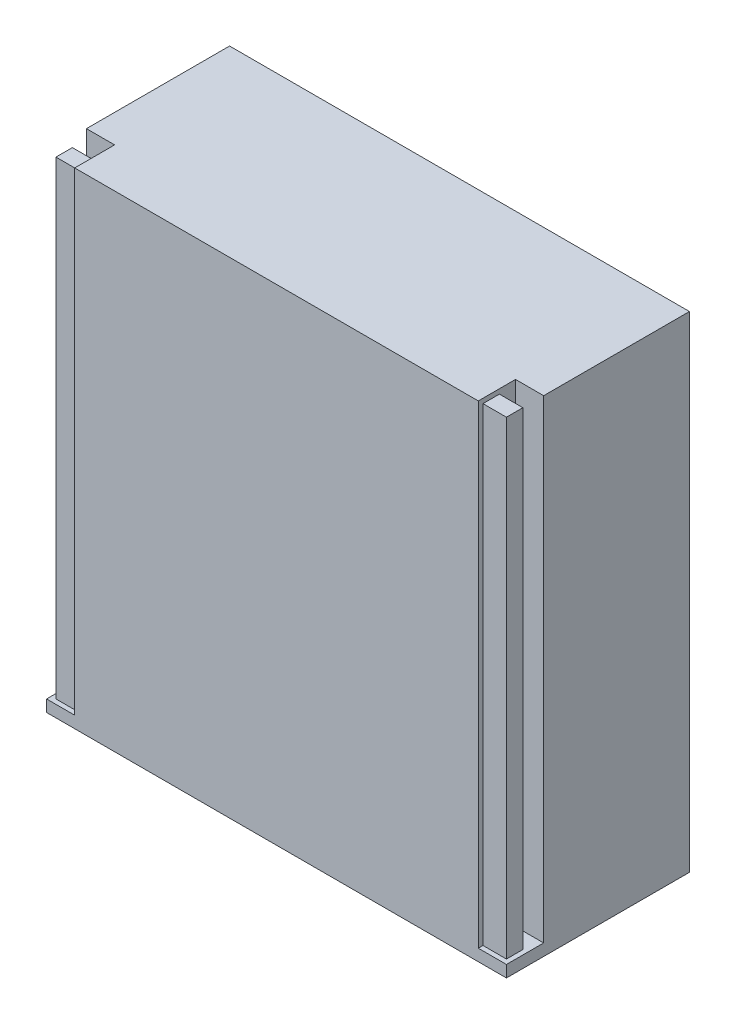
ISO-10303-21;
HEADER;
FILE_DESCRIPTION(('STEP AP214'),'2;1');
FILE_NAME('part.step','',(''),(''),'','','');
FILE_SCHEMA(('AUTOMOTIVE_DESIGN { 1 0 10303 214 1 1 1 1 }'));
ENDSEC;
DATA;
#1=APPLICATION_CONTEXT('core data for automotive mechanical design processes');
#2=APPLICATION_PROTOCOL_DEFINITION('international standard','automotive_design',2000,#1);
#3=PRODUCT_CONTEXT('',#1,'mechanical');
#4=PRODUCT('Part','Part','',(#3));
#5=PRODUCT_RELATED_PRODUCT_CATEGORY('part','',(#4));
#6=PRODUCT_DEFINITION_FORMATION('','',#4);
#7=PRODUCT_DEFINITION_CONTEXT('part definition',#1,'design');
#8=PRODUCT_DEFINITION('design','',#6,#7);
#9=PRODUCT_DEFINITION_SHAPE('','',#8);
#10=(LENGTH_UNIT() NAMED_UNIT(*) SI_UNIT(.MILLI.,.METRE.));
#11=(NAMED_UNIT(*) PLANE_ANGLE_UNIT() SI_UNIT($,.RADIAN.));
#12=(NAMED_UNIT(*) SI_UNIT($,.STERADIAN.) SOLID_ANGLE_UNIT());
#13=UNCERTAINTY_MEASURE_WITH_UNIT(LENGTH_MEASURE(1.E-05),#10,'distance_accuracy_value','');
#14=(GEOMETRIC_REPRESENTATION_CONTEXT(3) GLOBAL_UNCERTAINTY_ASSIGNED_CONTEXT((#13)) GLOBAL_UNIT_ASSIGNED_CONTEXT((#10,
#11,#12)) REPRESENTATION_CONTEXT('',''));
#15=CARTESIAN_POINT('',(0.,0.,0.));
#16=DIRECTION('',(0.,0.,1.));
#17=DIRECTION('',(1.,0.,0.));
#18=AXIS2_PLACEMENT_3D('',#15,#16,#17);
#19=CARTESIAN_POINT('',(0.,205.,0.));
#20=DIRECTION('',(0.,-1.,0.));
#21=DIRECTION('',(0.,0.,-1.));
#22=AXIS2_PLACEMENT_3D('',#19,#20,#21);
#23=PLANE('',#22);
#24=DIRECTION('',(0.,0.,-1.));
#25=VECTOR('',#24,1.);
#26=CARTESIAN_POINT('',(37.9403578528827,205.,24.1278950532166));
#27=LINE('',#26,#25);
#28=CARTESIAN_POINT('',(37.9403578528827,205.,38.));
#29=VERTEX_POINT('',#28);
#30=CARTESIAN_POINT('',(37.9403578528827,205.,31.));
#31=VERTEX_POINT('',#30);
#32=EDGE_CURVE('E11',#29,#31,#27,.T.);
#33=ORIENTED_EDGE('',*,*,#32,.F.);
#34=DIRECTION('',(1.,0.,0.));
#35=VECTOR('',#34,1.);
#36=CARTESIAN_POINT('',(37.9403578528827,205.,38.));
#37=LINE('',#36,#35);
#38=CARTESIAN_POINT('',(47.9403578528827,205.,38.));
#39=VERTEX_POINT('',#38);
#40=EDGE_CURVE('E393',#29,#39,#37,.T.);
#41=ORIENTED_EDGE('',*,*,#40,.T.);
#42=DIRECTION('',(0.,0.,-1.));
#43=VECTOR('',#42,1.);
#44=CARTESIAN_POINT('',(47.9403578528827,205.,38.));
#45=LINE('',#44,#43);
#46=CARTESIAN_POINT('',(47.9403578528827,205.,31.));
#47=VERTEX_POINT('',#46);
#48=EDGE_CURVE('E387',#39,#47,#45,.T.);
#49=ORIENTED_EDGE('',*,*,#48,.T.);
#50=DIRECTION('',(-1.,0.,0.));
#51=VECTOR('',#50,1.);
#52=CARTESIAN_POINT('',(47.9403578528827,205.,31.));
#53=LINE('',#52,#51);
#54=EDGE_CURVE('E390',#47,#31,#53,.T.);
#55=ORIENTED_EDGE('',*,*,#54,.T.);
#56=EDGE_LOOP('',(#33,#41,#49,#55));
#57=FACE_BOUND('',#56,.T.);
#58=ADVANCED_FACE('F39',(#57),#23,.F.);
#59=DIRECTION('',(0.,0.,1.));
#60=VECTOR('',#59,1.);
#61=CARTESIAN_POINT('',(-134.059642147117,205.,40.));
#62=LINE('',#61,#60);
#63=CARTESIAN_POINT('',(-134.059642147117,205.,31.));
#64=VERTEX_POINT('',#63);
#65=CARTESIAN_POINT('',(-134.059642147117,205.,38.));
#66=VERTEX_POINT('',#65);
#67=EDGE_CURVE('E48',#64,#66,#62,.T.);
#68=ORIENTED_EDGE('',*,*,#67,.F.);
#69=DIRECTION('',(-1.,0.,0.));
#70=VECTOR('',#69,1.);
#71=CARTESIAN_POINT('',(-144.059642147117,205.,31.));
#72=LINE('',#71,#70);
#73=CARTESIAN_POINT('',(-144.059642147117,205.,31.));
#74=VERTEX_POINT('',#73);
#75=EDGE_CURVE('E412',#64,#74,#72,.T.);
#76=ORIENTED_EDGE('',*,*,#75,.T.);
#77=DIRECTION('',(0.,0.,1.));
#78=VECTOR('',#77,1.);
#79=CARTESIAN_POINT('',(-144.059642147117,205.,38.));
#80=LINE('',#79,#78);
#81=CARTESIAN_POINT('',(-144.059642147117,205.,38.));
#82=VERTEX_POINT('',#81);
#83=EDGE_CURVE('E414',#74,#82,#80,.T.);
#84=ORIENTED_EDGE('',*,*,#83,.T.);
#85=DIRECTION('',(1.,0.,0.));
#86=VECTOR('',#85,1.);
#87=CARTESIAN_POINT('',(-134.059642147117,205.,38.));
#88=LINE('',#87,#86);
#89=EDGE_CURVE('E417',#82,#66,#88,.T.);
#90=ORIENTED_EDGE('',*,*,#89,.T.);
#91=EDGE_LOOP('',(#68,#76,#84,#90));
#92=FACE_BOUND('',#91,.T.);
#93=ADVANCED_FACE('F521',(#92),#23,.F.);
#94=CARTESIAN_POINT('',(0.,5.,0.));
#95=DIRECTION('',(0.,1.,0.));
#96=DIRECTION('',(0.,0.,1.));
#97=AXIS2_PLACEMENT_3D('',#94,#95,#96);
#98=PLANE('',#97);
#99=DIRECTION('',(1.,0.,0.));
#100=VECTOR('',#99,1.);
#101=CARTESIAN_POINT('',(-146.059642147117,5.,40.));
#102=LINE('',#101,#100);
#103=CARTESIAN_POINT('',(-146.059642147117,5.,40.));
#104=VERTEX_POINT('',#103);
#105=CARTESIAN_POINT('',(-134.059642147117,5.,40.));
#106=VERTEX_POINT('',#105);
#107=EDGE_CURVE('E446',#104,#106,#102,.T.);
#108=ORIENTED_EDGE('',*,*,#107,.T.);
#109=DIRECTION('',(0.,0.,1.));
#110=VECTOR('',#109,1.);
#111=CARTESIAN_POINT('',(-134.059642147117,5.,23.));
#112=LINE('',#111,#110);
#113=CARTESIAN_POINT('',(-134.059642147117,5.,38.));
#114=VERTEX_POINT('',#113);
#115=EDGE_CURVE('E327',#114,#106,#112,.T.);
#116=ORIENTED_EDGE('',*,*,#115,.F.);
#117=DIRECTION('',(1.,0.,0.));
#118=VECTOR('',#117,1.);
#119=CARTESIAN_POINT('',(-134.059642147117,5.,38.));
#120=LINE('',#119,#118);
#121=CARTESIAN_POINT('',(-144.059642147117,5.,38.));
#122=VERTEX_POINT('',#121);
#123=EDGE_CURVE('E415',#122,#114,#120,.T.);
#124=ORIENTED_EDGE('',*,*,#123,.F.);
#125=DIRECTION('',(0.,0.,1.));
#126=VECTOR('',#125,1.);
#127=CARTESIAN_POINT('',(-144.059642147117,5.,38.));
#128=LINE('',#127,#126);
#129=CARTESIAN_POINT('',(-144.059642147117,5.,31.));
#130=VERTEX_POINT('',#129);
#131=EDGE_CURVE('E421',#130,#122,#128,.T.);
#132=ORIENTED_EDGE('',*,*,#131,.F.);
#133=DIRECTION('',(-1.,0.,0.));
#134=VECTOR('',#133,1.);
#135=CARTESIAN_POINT('',(-144.059642147117,5.,31.));
#136=LINE('',#135,#134);
#137=CARTESIAN_POINT('',(-134.059642147117,5.,31.));
#138=VERTEX_POINT('',#137);
#139=EDGE_CURVE('E411',#138,#130,#136,.T.);
#140=ORIENTED_EDGE('',*,*,#139,.F.);
#141=CARTESIAN_POINT('',(-134.059642147117,5.,23.));
#142=VERTEX_POINT('',#141);
#143=EDGE_CURVE('E328',#142,#138,#112,.T.);
#144=ORIENTED_EDGE('',*,*,#143,.F.);
#145=DIRECTION('',(1.,0.,0.));
#146=VECTOR('',#145,1.);
#147=CARTESIAN_POINT('',(-146.059642147117,5.,23.));
#148=LINE('',#147,#146);
#149=CARTESIAN_POINT('',(-146.059642147117,5.,23.));
#150=VERTEX_POINT('',#149);
#151=EDGE_CURVE('E298',#150,#142,#148,.T.);
#152=ORIENTED_EDGE('',*,*,#151,.F.);
#153=DIRECTION('',(0.,0.,1.));
#154=VECTOR('',#153,1.);
#155=CARTESIAN_POINT('',(-146.059642147117,5.,-38.));
#156=LINE('',#155,#154);
#157=EDGE_CURVE('E443',#150,#104,#156,.T.);
#158=ORIENTED_EDGE('',*,*,#157,.T.);
#159=EDGE_LOOP('',(#108,#116,#124,#132,#140,#144,#152,#158));
#160=FACE_BOUND('',#159,.T.);
#161=ADVANCED_FACE('F485',(#160),#98,.T.);
#162=DIRECTION('',(1.,0.,0.));
#163=VECTOR('',#162,1.);
#164=CARTESIAN_POINT('',(37.9403578528827,5.,38.));
#165=LINE('',#164,#163);
#166=CARTESIAN_POINT('',(37.9403578528827,5.,38.));
#167=VERTEX_POINT('',#166);
#168=CARTESIAN_POINT('',(47.9403578528827,5.,38.));
#169=VERTEX_POINT('',#168);
#170=EDGE_CURVE('E391',#167,#169,#165,.T.);
#171=ORIENTED_EDGE('',*,*,#170,.F.);
#172=DIRECTION('',(0.,0.,-1.));
#173=VECTOR('',#172,1.);
#174=CARTESIAN_POINT('',(37.9403578528827,5.,40.));
#175=LINE('',#174,#173);
#176=CARTESIAN_POINT('',(37.9403578528827,5.,40.));
#177=VERTEX_POINT('',#176);
#178=EDGE_CURVE('E331',#177,#167,#175,.T.);
#179=ORIENTED_EDGE('',*,*,#178,.F.);
#180=CARTESIAN_POINT('',(49.9403578528827,5.,40.));
#181=VERTEX_POINT('',#180);
#182=EDGE_CURVE('E445',#177,#181,#102,.T.);
#183=ORIENTED_EDGE('',*,*,#182,.T.);
#184=DIRECTION('',(0.,0.,-1.));
#185=VECTOR('',#184,1.);
#186=CARTESIAN_POINT('',(49.9403578528827,5.,-38.));
#187=LINE('',#186,#185);
#188=CARTESIAN_POINT('',(49.9403578528827,5.,24.1278950532166));
#189=VERTEX_POINT('',#188);
#190=EDGE_CURVE('E436',#181,#189,#187,.T.);
#191=ORIENTED_EDGE('',*,*,#190,.T.);
#192=DIRECTION('',(1.,0.,0.));
#193=VECTOR('',#192,1.);
#194=CARTESIAN_POINT('',(37.9403578528827,5.,24.1278950532166));
#195=LINE('',#194,#193);
#196=CARTESIAN_POINT('',(37.9403578528827,5.,24.1278950532166));
#197=VERTEX_POINT('',#196);
#198=EDGE_CURVE('E333',#197,#189,#195,.T.);
#199=ORIENTED_EDGE('',*,*,#198,.F.);
#200=CARTESIAN_POINT('',(37.9403578528827,5.,31.));
#201=VERTEX_POINT('',#200);
#202=EDGE_CURVE('E330',#201,#197,#175,.T.);
#203=ORIENTED_EDGE('',*,*,#202,.F.);
#204=DIRECTION('',(-1.,0.,0.));
#205=VECTOR('',#204,1.);
#206=CARTESIAN_POINT('',(47.9403578528827,5.,31.));
#207=LINE('',#206,#205);
#208=CARTESIAN_POINT('',(47.9403578528827,5.,31.));
#209=VERTEX_POINT('',#208);
#210=EDGE_CURVE('E398',#209,#201,#207,.T.);
#211=ORIENTED_EDGE('',*,*,#210,.F.);
#212=DIRECTION('',(0.,0.,-1.));
#213=VECTOR('',#212,1.);
#214=CARTESIAN_POINT('',(47.9403578528827,5.,38.));
#215=LINE('',#214,#213);
#216=EDGE_CURVE('E386',#169,#209,#215,.T.);
#217=ORIENTED_EDGE('',*,*,#216,.F.);
#218=EDGE_LOOP('',(#171,#179,#183,#191,#199,#203,#211,#217));
#219=FACE_BOUND('',#218,.T.);
#220=ADVANCED_FACE('F500',(#219),#98,.T.);
#221=CARTESIAN_POINT('',(-83.0596421471173,5.,1.00000000000001));
#222=DIRECTION('',(0.,1.,0.));
#223=DIRECTION('',(0.,0.,1.));
#224=AXIS2_PLACEMENT_3D('',#221,#222,#223);
#225=CIRCLE('',#224,8.);
#226=CARTESIAN_POINT('',(-83.0596421471173,5.,-6.99999999999999));
#227=VERTEX_POINT('',#226);
#228=CARTESIAN_POINT('',(-83.0596421471173,5.,9.00000000000002));
#229=VERTEX_POINT('',#228);
#230=EDGE_CURVE('E271',#227,#229,#225,.T.);
#231=ORIENTED_EDGE('',*,*,#230,.F.);
#232=DIRECTION('',(-1.,0.,0.));
#233=VECTOR('',#232,1.);
#234=CARTESIAN_POINT('',(0.,5.,-6.99999999999998));
#235=LINE('',#234,#233);
#236=CARTESIAN_POINT('',(-13.0596421471173,5.,-6.99999999999998));
#237=VERTEX_POINT('',#236);
#238=EDGE_CURVE('E264',#237,#227,#235,.T.);
#239=ORIENTED_EDGE('',*,*,#238,.F.);
#240=CARTESIAN_POINT('',(-13.0596421471173,5.,1.00000000000002));
#241=DIRECTION('',(0.,1.,0.));
#242=DIRECTION('',(0.,0.,1.));
#243=AXIS2_PLACEMENT_3D('',#240,#241,#242);
#244=CIRCLE('',#243,8.);
#245=CARTESIAN_POINT('',(-13.0596421471173,5.,9.00000000000003));
#246=VERTEX_POINT('',#245);
#247=EDGE_CURVE('E244',#246,#237,#244,.T.);
#248=ORIENTED_EDGE('',*,*,#247,.F.);
#249=DIRECTION('',(1.,0.,0.));
#250=VECTOR('',#249,1.);
#251=CARTESIAN_POINT('',(0.,5.,9.00000000000003));
#252=LINE('',#251,#250);
#253=EDGE_CURVE('E269',#229,#246,#252,.T.);
#254=ORIENTED_EDGE('',*,*,#253,.F.);
#255=EDGE_LOOP('',(#231,#239,#248,#254));
#256=FACE_BOUND('',#255,.T.);
#257=DIRECTION('',(-1.,0.,0.));
#258=VECTOR('',#257,1.);
#259=CARTESIAN_POINT('',(47.9403578528827,5.,22.1278950532166));
#260=LINE('',#259,#258);
#261=CARTESIAN_POINT('',(47.9403578528827,5.,22.1278950532166));
#262=VERTEX_POINT('',#261);
#263=CARTESIAN_POINT('',(35.9403578528827,5.,22.1278950532166));
#264=VERTEX_POINT('',#263);
#265=EDGE_CURVE('E337',#262,#264,#260,.T.);
#266=ORIENTED_EDGE('',*,*,#265,.F.);
#267=DIRECTION('',(0.,0.,1.));
#268=VECTOR('',#267,1.);
#269=CARTESIAN_POINT('',(47.9403578528827,5.,-38.));
#270=LINE('',#269,#268);
#271=CARTESIAN_POINT('',(47.9403578528827,5.,-38.));
#272=VERTEX_POINT('',#271);
#273=EDGE_CURVE('E335',#272,#262,#270,.T.);
#274=ORIENTED_EDGE('',*,*,#273,.F.);
#275=DIRECTION('',(-1.,0.,0.));
#276=VECTOR('',#275,1.);
#277=CARTESIAN_POINT('',(-146.059642147117,5.,-38.));
#278=LINE('',#277,#276);
#279=CARTESIAN_POINT('',(-144.059642147117,5.,-38.));
#280=VERTEX_POINT('',#279);
#281=EDGE_CURVE('E439',#272,#280,#278,.T.);
#282=ORIENTED_EDGE('',*,*,#281,.T.);
#283=DIRECTION('',(0.,0.,-1.));
#284=VECTOR('',#283,1.);
#285=CARTESIAN_POINT('',(-144.059642147117,5.,21.1709039048602));
#286=LINE('',#285,#284);
#287=CARTESIAN_POINT('',(-144.059642147117,5.,21.1709039048602));
#288=VERTEX_POINT('',#287);
#289=EDGE_CURVE('E307',#288,#280,#286,.T.);
#290=ORIENTED_EDGE('',*,*,#289,.F.);
#291=DIRECTION('',(-1.,0.,0.));
#292=VECTOR('',#291,1.);
#293=CARTESIAN_POINT('',(-132.059642147117,5.,21.1709039048602));
#294=LINE('',#293,#292);
#295=CARTESIAN_POINT('',(-132.059642147117,5.,21.1709039048602));
#296=VERTEX_POINT('',#295);
#297=EDGE_CURVE('E345',#296,#288,#294,.T.);
#298=ORIENTED_EDGE('',*,*,#297,.F.);
#299=DIRECTION('',(0.,0.,-1.));
#300=VECTOR('',#299,1.);
#301=CARTESIAN_POINT('',(-132.059642147117,5.,38.));
#302=LINE('',#301,#300);
#303=CARTESIAN_POINT('',(-132.059642147117,5.,38.));
#304=VERTEX_POINT('',#303);
#305=EDGE_CURVE('E343',#304,#296,#302,.T.);
#306=ORIENTED_EDGE('',*,*,#305,.F.);
#307=DIRECTION('',(-1.,0.,0.));
#308=VECTOR('',#307,1.);
#309=CARTESIAN_POINT('',(35.9403578528827,5.,38.));
#310=LINE('',#309,#308);
#311=CARTESIAN_POINT('',(35.9403578528827,5.,38.));
#312=VERTEX_POINT('',#311);
#313=EDGE_CURVE('E341',#312,#304,#310,.T.);
#314=ORIENTED_EDGE('',*,*,#313,.F.);
#315=DIRECTION('',(0.,0.,1.));
#316=VECTOR('',#315,1.);
#317=CARTESIAN_POINT('',(35.9403578528827,5.,22.1278950532166));
#318=LINE('',#317,#316);
#319=EDGE_CURVE('E339',#264,#312,#318,.T.);
#320=ORIENTED_EDGE('',*,*,#319,.F.);
#321=EDGE_LOOP('',(#266,#274,#282,#290,#298,#306,#314,#320));
#322=FACE_BOUND('',#321,.T.);
#323=ADVANCED_FACE('F547',(#256,#322),#98,.T.);
#324=CARTESIAN_POINT('',(49.9403578528827,5.,-38.));
#325=DIRECTION('',(-1.,0.,0.));
#326=DIRECTION('',(0.,0.,1.));
#327=AXIS2_PLACEMENT_3D('',#324,#325,#326);
#328=PLANE('',#327);
#329=DIRECTION('',(0.,0.,-1.));
#330=VECTOR('',#329,1.);
#331=CARTESIAN_POINT('',(49.9403578528827,0.,-38.));
#332=LINE('',#331,#330);
#333=CARTESIAN_POINT('',(49.9403578528827,0.,40.));
#334=VERTEX_POINT('',#333);
#335=CARTESIAN_POINT('',(49.9403578528827,0.,-38.));
#336=VERTEX_POINT('',#335);
#337=EDGE_CURVE('E435',#334,#336,#332,.T.);
#338=ORIENTED_EDGE('',*,*,#337,.T.);
#339=DIRECTION('',(0.,-1.,0.));
#340=VECTOR('',#339,1.);
#341=CARTESIAN_POINT('',(49.9403578528827,5.,-38.));
#342=LINE('',#341,#340);
#343=CARTESIAN_POINT('',(49.9403578528827,207.,-38.));
#344=VERTEX_POINT('',#343);
#345=EDGE_CURVE('E43',#344,#336,#342,.T.);
#346=ORIENTED_EDGE('',*,*,#345,.F.);
#347=DIRECTION('',(0.,0.,-1.));
#348=VECTOR('',#347,1.);
#349=CARTESIAN_POINT('',(49.9403578528827,207.,-38.));
#350=LINE('',#349,#348);
#351=CARTESIAN_POINT('',(49.9403578528827,207.,24.1278950532166));
#352=VERTEX_POINT('',#351);
#353=EDGE_CURVE('E292',#352,#344,#350,.T.);
#354=ORIENTED_EDGE('',*,*,#353,.F.);
#355=DIRECTION('',(0.,-1.,0.));
#356=VECTOR('',#355,1.);
#357=CARTESIAN_POINT('',(49.9403578528827,205.,24.1278950532166));
#358=LINE('',#357,#356);
#359=EDGE_CURVE('E370',#352,#189,#358,.T.);
#360=ORIENTED_EDGE('',*,*,#359,.T.);
#361=ORIENTED_EDGE('',*,*,#190,.F.);
#362=DIRECTION('',(0.,-1.,0.));
#363=VECTOR('',#362,1.);
#364=CARTESIAN_POINT('',(49.9403578528827,5.,40.));
#365=LINE('',#364,#363);
#366=EDGE_CURVE('E449',#181,#334,#365,.T.);
#367=ORIENTED_EDGE('',*,*,#366,.T.);
#368=EDGE_LOOP('',(#338,#346,#354,#360,#361,#367));
#369=FACE_BOUND('',#368,.T.);
#370=ADVANCED_FACE('F41',(#369),#328,.F.);
#371=CARTESIAN_POINT('',(-146.059642147117,5.,-38.));
#372=DIRECTION('',(0.,0.,1.));
#373=DIRECTION('',(1.,0.,0.));
#374=AXIS2_PLACEMENT_3D('',#371,#372,#373);
#375=PLANE('',#374);
#376=DIRECTION('',(0.,-1.,0.));
#377=VECTOR('',#376,1.);
#378=CARTESIAN_POINT('',(47.9403578528827,205.,-38.));
#379=LINE('',#378,#377);
#380=CARTESIAN_POINT('',(47.9403578528827,205.,-38.));
#381=VERTEX_POINT('',#380);
#382=EDGE_CURVE('E368',#381,#272,#379,.T.);
#383=ORIENTED_EDGE('',*,*,#382,.F.);
#384=DIRECTION('',(-1.,0.,0.));
#385=VECTOR('',#384,1.);
#386=CARTESIAN_POINT('',(-146.059642147117,205.,-38.));
#387=LINE('',#386,#385);
#388=CARTESIAN_POINT('',(-144.059642147117,205.,-38.));
#389=VERTEX_POINT('',#388);
#390=EDGE_CURVE('E273',#381,#389,#387,.T.);
#391=ORIENTED_EDGE('',*,*,#390,.T.);
#392=DIRECTION('',(0.,-1.,0.));
#393=VECTOR('',#392,1.);
#394=CARTESIAN_POINT('',(-144.059642147117,205.,-38.));
#395=LINE('',#394,#393);
#396=EDGE_CURVE('E325',#389,#280,#395,.T.);
#397=ORIENTED_EDGE('',*,*,#396,.T.);
#398=ORIENTED_EDGE('',*,*,#281,.F.);
#399=EDGE_LOOP('',(#383,#391,#397,#398));
#400=FACE_BOUND('',#399,.T.);
#401=DIRECTION('',(-1.,0.,0.));
#402=VECTOR('',#401,1.);
#403=CARTESIAN_POINT('',(-146.059642147117,0.,-38.));
#404=LINE('',#403,#402);
#405=CARTESIAN_POINT('',(-146.059642147117,0.,-38.));
#406=VERTEX_POINT('',#405);
#407=EDGE_CURVE('E452',#336,#406,#404,.T.);
#408=ORIENTED_EDGE('',*,*,#407,.T.);
#409=DIRECTION('',(0.,-1.,0.));
#410=VECTOR('',#409,1.);
#411=CARTESIAN_POINT('',(-146.059642147117,5.,-38.));
#412=LINE('',#411,#410);
#413=CARTESIAN_POINT('',(-146.059642147117,207.,-38.));
#414=VERTEX_POINT('',#413);
#415=EDGE_CURVE('E461',#414,#406,#412,.T.);
#416=ORIENTED_EDGE('',*,*,#415,.F.);
#417=DIRECTION('',(-1.,0.,0.));
#418=VECTOR('',#417,1.);
#419=CARTESIAN_POINT('',(-146.059642147117,207.,-38.));
#420=LINE('',#419,#418);
#421=EDGE_CURVE('E295',#344,#414,#420,.T.);
#422=ORIENTED_EDGE('',*,*,#421,.F.);
#423=ORIENTED_EDGE('',*,*,#345,.T.);
#424=EDGE_LOOP('',(#408,#416,#422,#423));
#425=FACE_BOUND('',#424,.T.);
#426=ADVANCED_FACE('F469',(#400,#425),#375,.F.);
#427=CARTESIAN_POINT('',(-146.059642147117,5.,-38.));
#428=DIRECTION('',(1.,0.,0.));
#429=DIRECTION('',(0.,0.,-1.));
#430=AXIS2_PLACEMENT_3D('',#427,#428,#429);
#431=PLANE('',#430);
#432=DIRECTION('',(0.,0.,1.));
#433=VECTOR('',#432,1.);
#434=CARTESIAN_POINT('',(-146.059642147117,0.,-38.));
#435=LINE('',#434,#433);
#436=CARTESIAN_POINT('',(-146.059642147117,0.,40.));
#437=VERTEX_POINT('',#436);
#438=EDGE_CURVE('E454',#406,#437,#435,.T.);
#439=ORIENTED_EDGE('',*,*,#438,.T.);
#440=DIRECTION('',(0.,-1.,0.));
#441=VECTOR('',#440,1.);
#442=CARTESIAN_POINT('',(-146.059642147117,5.,40.));
#443=LINE('',#442,#441);
#444=EDGE_CURVE('E459',#104,#437,#443,.T.);
#445=ORIENTED_EDGE('',*,*,#444,.F.);
#446=ORIENTED_EDGE('',*,*,#157,.F.);
#447=DIRECTION('',(0.,-1.,0.));
#448=VECTOR('',#447,1.);
#449=CARTESIAN_POINT('',(-146.059642147117,205.,23.));
#450=LINE('',#449,#448);
#451=CARTESIAN_POINT('',(-146.059642147117,207.,23.));
#452=VERTEX_POINT('',#451);
#453=EDGE_CURVE('E384',#452,#150,#450,.T.);
#454=ORIENTED_EDGE('',*,*,#453,.F.);
#455=DIRECTION('',(0.,0.,1.));
#456=VECTOR('',#455,1.);
#457=CARTESIAN_POINT('',(-146.059642147117,207.,23.));
#458=LINE('',#457,#456);
#459=EDGE_CURVE('E274',#414,#452,#458,.T.);
#460=ORIENTED_EDGE('',*,*,#459,.F.);
#461=ORIENTED_EDGE('',*,*,#415,.T.);
#462=EDGE_LOOP('',(#439,#445,#446,#454,#460,#461));
#463=FACE_BOUND('',#462,.T.);
#464=ADVANCED_FACE('F477',(#463),#431,.F.);
#465=CARTESIAN_POINT('',(-146.059642147117,5.,40.));
#466=DIRECTION('',(0.,0.,-1.));
#467=DIRECTION('',(-1.,0.,0.));
#468=AXIS2_PLACEMENT_3D('',#465,#466,#467);
#469=PLANE('',#468);
#470=DIRECTION('',(1.,0.,0.));
#471=VECTOR('',#470,1.);
#472=CARTESIAN_POINT('',(-146.059642147117,0.,40.));
#473=LINE('',#472,#471);
#474=EDGE_CURVE('E440',#437,#334,#473,.T.);
#475=ORIENTED_EDGE('',*,*,#474,.T.);
#476=ORIENTED_EDGE('',*,*,#366,.F.);
#477=ORIENTED_EDGE('',*,*,#182,.F.);
#478=DIRECTION('',(0.,-1.,0.));
#479=VECTOR('',#478,1.);
#480=CARTESIAN_POINT('',(37.9403578528827,205.,40.));
#481=LINE('',#480,#479);
#482=CARTESIAN_POINT('',(37.9403578528827,207.,40.));
#483=VERTEX_POINT('',#482);
#484=EDGE_CURVE('E376',#483,#177,#481,.T.);
#485=ORIENTED_EDGE('',*,*,#484,.F.);
#486=DIRECTION('',(1.,0.,0.));
#487=VECTOR('',#486,1.);
#488=CARTESIAN_POINT('',(37.9403578528827,207.,40.));
#489=LINE('',#488,#487);
#490=CARTESIAN_POINT('',(-134.059642147117,207.,40.));
#491=VERTEX_POINT('',#490);
#492=EDGE_CURVE('E283',#491,#483,#489,.T.);
#493=ORIENTED_EDGE('',*,*,#492,.F.);
#494=DIRECTION('',(0.,-1.,0.));
#495=VECTOR('',#494,1.);
#496=CARTESIAN_POINT('',(-134.059642147117,205.,40.));
#497=LINE('',#496,#495);
#498=EDGE_CURVE('E378',#491,#106,#497,.T.);
#499=ORIENTED_EDGE('',*,*,#498,.T.);
#500=ORIENTED_EDGE('',*,*,#107,.F.);
#501=ORIENTED_EDGE('',*,*,#444,.T.);
#502=EDGE_LOOP('',(#475,#476,#477,#485,#493,#499,#500,#501));
#503=FACE_BOUND('',#502,.T.);
#504=ADVANCED_FACE('F481',(#503),#469,.F.);
#505=CARTESIAN_POINT('',(0.,0.,0.));
#506=DIRECTION('',(0.,1.,0.));
#507=DIRECTION('',(0.,0.,1.));
#508=AXIS2_PLACEMENT_3D('',#505,#506,#507);
#509=PLANE('',#508);
#510=DIRECTION('',(1.,0.,0.));
#511=VECTOR('',#510,1.);
#512=CARTESIAN_POINT('',(-83.0596421471173,0.,-6.99999999999999));
#513=LINE('',#512,#511);
#514=CARTESIAN_POINT('',(-83.0596421471173,0.,-6.99999999999999));
#515=VERTEX_POINT('',#514);
#516=CARTESIAN_POINT('',(-13.0596421471173,0.,-6.99999999999998));
#517=VERTEX_POINT('',#516);
#518=EDGE_CURVE('E250',#515,#517,#513,.T.);
#519=ORIENTED_EDGE('',*,*,#518,.F.);
#520=CARTESIAN_POINT('',(-83.0596421471173,0.,1.00000000000001));
#521=DIRECTION('',(0.,-1.,0.));
#522=DIRECTION('',(0.,0.,-1.));
#523=AXIS2_PLACEMENT_3D('',#520,#521,#522);
#524=CIRCLE('',#523,8.);
#525=CARTESIAN_POINT('',(-83.0596421471173,0.,9.00000000000002));
#526=VERTEX_POINT('',#525);
#527=EDGE_CURVE('E64',#526,#515,#524,.T.);
#528=ORIENTED_EDGE('',*,*,#527,.F.);
#529=DIRECTION('',(-1.,0.,0.));
#530=VECTOR('',#529,1.);
#531=CARTESIAN_POINT('',(-83.0596421471173,0.,9.00000000000002));
#532=LINE('',#531,#530);
#533=CARTESIAN_POINT('',(-13.0596421471173,0.,9.00000000000003));
#534=VERTEX_POINT('',#533);
#535=EDGE_CURVE('E257',#534,#526,#532,.T.);
#536=ORIENTED_EDGE('',*,*,#535,.F.);
#537=CARTESIAN_POINT('',(-13.0596421471173,0.,1.00000000000002));
#538=DIRECTION('',(0.,-1.,0.));
#539=DIRECTION('',(0.,0.,-1.));
#540=AXIS2_PLACEMENT_3D('',#537,#538,#539);
#541=CIRCLE('',#540,8.);
#542=EDGE_CURVE('E241',#517,#534,#541,.T.);
#543=ORIENTED_EDGE('',*,*,#542,.F.);
#544=EDGE_LOOP('',(#519,#528,#536,#543));
#545=FACE_BOUND('',#544,.T.);
#546=ORIENTED_EDGE('',*,*,#337,.F.);
#547=ORIENTED_EDGE('',*,*,#474,.F.);
#548=ORIENTED_EDGE('',*,*,#438,.F.);
#549=ORIENTED_EDGE('',*,*,#407,.F.);
#550=EDGE_LOOP('',(#546,#547,#548,#549));
#551=FACE_BOUND('',#550,.T.);
#552=ADVANCED_FACE('F254',(#545,#551),#509,.F.);
#553=CARTESIAN_POINT('',(-144.059642147117,205.,31.));
#554=DIRECTION('',(0.,0.,1.));
#555=DIRECTION('',(1.,0.,0.));
#556=AXIS2_PLACEMENT_3D('',#553,#554,#555);
#557=PLANE('',#556);
#558=ORIENTED_EDGE('',*,*,#139,.T.);
#559=DIRECTION('',(0.,-1.,0.));
#560=VECTOR('',#559,1.);
#561=CARTESIAN_POINT('',(-144.059642147117,205.,31.));
#562=LINE('',#561,#560);
#563=EDGE_CURVE('E429',#74,#130,#562,.T.);
#564=ORIENTED_EDGE('',*,*,#563,.F.);
#565=ORIENTED_EDGE('',*,*,#75,.F.);
#566=DIRECTION('',(0.,-1.,0.));
#567=VECTOR('',#566,1.);
#568=CARTESIAN_POINT('',(-134.059642147117,205.,31.));
#569=LINE('',#568,#567);
#570=EDGE_CURVE('E432',#64,#138,#569,.T.);
#571=ORIENTED_EDGE('',*,*,#570,.T.);
#572=EDGE_LOOP('',(#558,#564,#565,#571));
#573=FACE_BOUND('',#572,.T.);
#574=ADVANCED_FACE('F540',(#573),#557,.F.);
#575=CARTESIAN_POINT('',(-144.059642147117,205.,38.));
#576=DIRECTION('',(1.,0.,0.));
#577=DIRECTION('',(0.,0.,-1.));
#578=AXIS2_PLACEMENT_3D('',#575,#576,#577);
#579=PLANE('',#578);
#580=ORIENTED_EDGE('',*,*,#131,.T.);
#581=DIRECTION('',(0.,-1.,0.));
#582=VECTOR('',#581,1.);
#583=CARTESIAN_POINT('',(-144.059642147117,205.,38.));
#584=LINE('',#583,#582);
#585=EDGE_CURVE('E427',#82,#122,#584,.T.);
#586=ORIENTED_EDGE('',*,*,#585,.F.);
#587=ORIENTED_EDGE('',*,*,#83,.F.);
#588=ORIENTED_EDGE('',*,*,#563,.T.);
#589=EDGE_LOOP('',(#580,#586,#587,#588));
#590=FACE_BOUND('',#589,.T.);
#591=ADVANCED_FACE('F536',(#590),#579,.F.);
#592=CARTESIAN_POINT('',(-134.059642147117,205.,38.));
#593=DIRECTION('',(0.,0.,-1.));
#594=DIRECTION('',(-1.,0.,0.));
#595=AXIS2_PLACEMENT_3D('',#592,#593,#594);
#596=PLANE('',#595);
#597=ORIENTED_EDGE('',*,*,#123,.T.);
#598=DIRECTION('',(0.,-1.,0.));
#599=VECTOR('',#598,1.);
#600=CARTESIAN_POINT('',(-134.059642147117,205.,38.));
#601=LINE('',#600,#599);
#602=EDGE_CURVE('E419',#66,#114,#601,.T.);
#603=ORIENTED_EDGE('',*,*,#602,.F.);
#604=ORIENTED_EDGE('',*,*,#89,.F.);
#605=ORIENTED_EDGE('',*,*,#585,.T.);
#606=EDGE_LOOP('',(#597,#603,#604,#605));
#607=FACE_BOUND('',#606,.T.);
#608=ADVANCED_FACE('F533',(#607),#596,.F.);
#609=CARTESIAN_POINT('',(47.9403578528827,205.,38.));
#610=DIRECTION('',(-1.,0.,0.));
#611=DIRECTION('',(0.,0.,1.));
#612=AXIS2_PLACEMENT_3D('',#609,#610,#611);
#613=PLANE('',#612);
#614=ORIENTED_EDGE('',*,*,#216,.T.);
#615=DIRECTION('',(0.,-1.,0.));
#616=VECTOR('',#615,1.);
#617=CARTESIAN_POINT('',(47.9403578528827,205.,31.));
#618=LINE('',#617,#616);
#619=EDGE_CURVE('E409',#47,#209,#618,.T.);
#620=ORIENTED_EDGE('',*,*,#619,.F.);
#621=ORIENTED_EDGE('',*,*,#48,.F.);
#622=DIRECTION('',(0.,-1.,0.));
#623=VECTOR('',#622,1.);
#624=CARTESIAN_POINT('',(47.9403578528827,205.,38.));
#625=LINE('',#624,#623);
#626=EDGE_CURVE('E395',#39,#169,#625,.T.);
#627=ORIENTED_EDGE('',*,*,#626,.T.);
#628=EDGE_LOOP('',(#614,#620,#621,#627));
#629=FACE_BOUND('',#628,.T.);
#630=ADVANCED_FACE('F531',(#629),#613,.F.);
#631=CARTESIAN_POINT('',(47.9403578528827,205.,31.));
#632=DIRECTION('',(0.,0.,1.));
#633=DIRECTION('',(1.,0.,0.));
#634=AXIS2_PLACEMENT_3D('',#631,#632,#633);
#635=PLANE('',#634);
#636=ORIENTED_EDGE('',*,*,#210,.T.);
#637=DIRECTION('',(0.,-1.,0.));
#638=VECTOR('',#637,1.);
#639=CARTESIAN_POINT('',(37.9403578528827,205.,31.));
#640=LINE('',#639,#638);
#641=EDGE_CURVE('E407',#31,#201,#640,.T.);
#642=ORIENTED_EDGE('',*,*,#641,.F.);
#643=ORIENTED_EDGE('',*,*,#54,.F.);
#644=ORIENTED_EDGE('',*,*,#619,.T.);
#645=EDGE_LOOP('',(#636,#642,#643,#644));
#646=FACE_BOUND('',#645,.T.);
#647=ADVANCED_FACE('F764',(#646),#635,.F.);
#648=CARTESIAN_POINT('',(37.9403578528827,205.,38.));
#649=DIRECTION('',(0.,0.,-1.));
#650=DIRECTION('',(-1.,0.,0.));
#651=AXIS2_PLACEMENT_3D('',#648,#649,#650);
#652=PLANE('',#651);
#653=ORIENTED_EDGE('',*,*,#170,.T.);
#654=ORIENTED_EDGE('',*,*,#626,.F.);
#655=ORIENTED_EDGE('',*,*,#40,.F.);
#656=DIRECTION('',(0.,-1.,0.));
#657=VECTOR('',#656,1.);
#658=CARTESIAN_POINT('',(37.9403578528827,205.,38.));
#659=LINE('',#658,#657);
#660=EDGE_CURVE('E404',#29,#167,#659,.T.);
#661=ORIENTED_EDGE('',*,*,#660,.T.);
#662=EDGE_LOOP('',(#653,#654,#655,#661));
#663=FACE_BOUND('',#662,.T.);
#664=ADVANCED_FACE('F684',(#663),#652,.F.);
#665=CARTESIAN_POINT('',(-134.059642147117,205.,23.));
#666=DIRECTION('',(1.,0.,0.));
#667=DIRECTION('',(0.,0.,-1.));
#668=AXIS2_PLACEMENT_3D('',#665,#666,#667);
#669=PLANE('',#668);
#670=ORIENTED_EDGE('',*,*,#143,.T.);
#671=ORIENTED_EDGE('',*,*,#570,.F.);
#672=ORIENTED_EDGE('',*,*,#67,.T.);
#673=ORIENTED_EDGE('',*,*,#602,.T.);
#674=ORIENTED_EDGE('',*,*,#115,.T.);
#675=ORIENTED_EDGE('',*,*,#498,.F.);
#676=DIRECTION('',(0.,0.,1.));
#677=VECTOR('',#676,1.);
#678=CARTESIAN_POINT('',(-134.059642147117,207.,40.));
#679=LINE('',#678,#677);
#680=CARTESIAN_POINT('',(-134.059642147117,207.,23.));
#681=VERTEX_POINT('',#680);
#682=EDGE_CURVE('E280',#681,#491,#679,.T.);
#683=ORIENTED_EDGE('',*,*,#682,.F.);
#684=DIRECTION('',(0.,-1.,0.));
#685=VECTOR('',#684,1.);
#686=CARTESIAN_POINT('',(-134.059642147117,205.,23.));
#687=LINE('',#686,#685);
#688=EDGE_CURVE('E381',#681,#142,#687,.T.);
#689=ORIENTED_EDGE('',*,*,#688,.T.);
#690=EDGE_LOOP('',(#670,#671,#672,#673,#674,#675,#683,#689));
#691=FACE_BOUND('',#690,.T.);
#692=ADVANCED_FACE('F679',(#691),#669,.F.);
#693=CARTESIAN_POINT('',(37.9403578528827,205.,40.));
#694=DIRECTION('',(-1.,0.,0.));
#695=DIRECTION('',(0.,0.,1.));
#696=AXIS2_PLACEMENT_3D('',#693,#694,#695);
#697=PLANE('',#696);
#698=DIRECTION('',(0.,-1.,0.));
#699=VECTOR('',#698,1.);
#700=CARTESIAN_POINT('',(37.9403578528827,205.,24.1278950532166));
#701=LINE('',#700,#699);
#702=CARTESIAN_POINT('',(37.9403578528827,207.,24.1278950532166));
#703=VERTEX_POINT('',#702);
#704=EDGE_CURVE('E373',#703,#197,#701,.T.);
#705=ORIENTED_EDGE('',*,*,#704,.F.);
#706=DIRECTION('',(0.,0.,-1.));
#707=VECTOR('',#706,1.);
#708=CARTESIAN_POINT('',(37.9403578528827,207.,24.1278950532166));
#709=LINE('',#708,#707);
#710=EDGE_CURVE('E286',#483,#703,#709,.T.);
#711=ORIENTED_EDGE('',*,*,#710,.F.);
#712=ORIENTED_EDGE('',*,*,#484,.T.);
#713=ORIENTED_EDGE('',*,*,#178,.T.);
#714=ORIENTED_EDGE('',*,*,#660,.F.);
#715=ORIENTED_EDGE('',*,*,#32,.T.);
#716=ORIENTED_EDGE('',*,*,#641,.T.);
#717=ORIENTED_EDGE('',*,*,#202,.T.);
#718=EDGE_LOOP('',(#705,#711,#712,#713,#714,#715,#716,#717));
#719=FACE_BOUND('',#718,.T.);
#720=ADVANCED_FACE('F506',(#719),#697,.F.);
#721=CARTESIAN_POINT('',(-146.059642147117,205.,23.));
#722=DIRECTION('',(0.,0.,-1.));
#723=DIRECTION('',(-1.,0.,0.));
#724=AXIS2_PLACEMENT_3D('',#721,#722,#723);
#725=PLANE('',#724);
#726=ORIENTED_EDGE('',*,*,#151,.T.);
#727=ORIENTED_EDGE('',*,*,#688,.F.);
#728=DIRECTION('',(1.,0.,0.));
#729=VECTOR('',#728,1.);
#730=CARTESIAN_POINT('',(-134.059642147117,207.,23.));
#731=LINE('',#730,#729);
#732=EDGE_CURVE('E277',#452,#681,#731,.T.);
#733=ORIENTED_EDGE('',*,*,#732,.F.);
#734=ORIENTED_EDGE('',*,*,#453,.T.);
#735=EDGE_LOOP('',(#726,#727,#733,#734));
#736=FACE_BOUND('',#735,.T.);
#737=ADVANCED_FACE('F491',(#736),#725,.F.);
#738=CARTESIAN_POINT('',(37.9403578528827,205.,24.1278950532166));
#739=DIRECTION('',(0.,0.,-1.));
#740=DIRECTION('',(-1.,0.,0.));
#741=AXIS2_PLACEMENT_3D('',#738,#739,#740);
#742=PLANE('',#741);
#743=ORIENTED_EDGE('',*,*,#198,.T.);
#744=ORIENTED_EDGE('',*,*,#359,.F.);
#745=DIRECTION('',(1.,0.,0.));
#746=VECTOR('',#745,1.);
#747=CARTESIAN_POINT('',(49.9403578528827,207.,24.1278950532166));
#748=LINE('',#747,#746);
#749=EDGE_CURVE('E289',#703,#352,#748,.T.);
#750=ORIENTED_EDGE('',*,*,#749,.F.);
#751=ORIENTED_EDGE('',*,*,#704,.T.);
#752=EDGE_LOOP('',(#743,#744,#750,#751));
#753=FACE_BOUND('',#752,.T.);
#754=ADVANCED_FACE('F507',(#753),#742,.F.);
#755=CARTESIAN_POINT('',(47.9403578528827,205.,-38.));
#756=DIRECTION('',(1.,0.,0.));
#757=DIRECTION('',(0.,0.,-1.));
#758=AXIS2_PLACEMENT_3D('',#755,#756,#757);
#759=PLANE('',#758);
#760=ORIENTED_EDGE('',*,*,#273,.T.);
#761=DIRECTION('',(0.,-1.,0.));
#762=VECTOR('',#761,1.);
#763=CARTESIAN_POINT('',(47.9403578528827,205.,22.1278950532166));
#764=LINE('',#763,#762);
#765=CARTESIAN_POINT('',(47.9403578528827,205.,22.1278950532166));
#766=VERTEX_POINT('',#765);
#767=EDGE_CURVE('E365',#766,#262,#764,.T.);
#768=ORIENTED_EDGE('',*,*,#767,.F.);
#769=DIRECTION('',(0.,0.,1.));
#770=VECTOR('',#769,1.);
#771=CARTESIAN_POINT('',(47.9403578528827,205.,-38.));
#772=LINE('',#771,#770);
#773=EDGE_CURVE('E303',#381,#766,#772,.T.);
#774=ORIENTED_EDGE('',*,*,#773,.F.);
#775=ORIENTED_EDGE('',*,*,#382,.T.);
#776=EDGE_LOOP('',(#760,#768,#774,#775));
#777=FACE_BOUND('',#776,.T.);
#778=ADVANCED_FACE('F509',(#777),#759,.F.);
#779=CARTESIAN_POINT('',(47.9403578528827,205.,22.1278950532166));
#780=DIRECTION('',(0.,0.,1.));
#781=DIRECTION('',(1.,0.,0.));
#782=AXIS2_PLACEMENT_3D('',#779,#780,#781);
#783=PLANE('',#782);
#784=ORIENTED_EDGE('',*,*,#265,.T.);
#785=DIRECTION('',(0.,-1.,0.));
#786=VECTOR('',#785,1.);
#787=CARTESIAN_POINT('',(35.9403578528827,205.,22.1278950532166));
#788=LINE('',#787,#786);
#789=CARTESIAN_POINT('',(35.9403578528827,205.,22.1278950532166));
#790=VERTEX_POINT('',#789);
#791=EDGE_CURVE('E362',#790,#264,#788,.T.);
#792=ORIENTED_EDGE('',*,*,#791,.F.);
#793=DIRECTION('',(-1.,0.,0.));
#794=VECTOR('',#793,1.);
#795=CARTESIAN_POINT('',(47.9403578528827,205.,22.1278950532166));
#796=LINE('',#795,#794);
#797=EDGE_CURVE('E306',#766,#790,#796,.T.);
#798=ORIENTED_EDGE('',*,*,#797,.F.);
#799=ORIENTED_EDGE('',*,*,#767,.T.);
#800=EDGE_LOOP('',(#784,#792,#798,#799));
#801=FACE_BOUND('',#800,.T.);
#802=ADVANCED_FACE('F515',(#801),#783,.F.);
#803=CARTESIAN_POINT('',(35.9403578528827,205.,22.1278950532166));
#804=DIRECTION('',(1.,0.,0.));
#805=DIRECTION('',(0.,0.,-1.));
#806=AXIS2_PLACEMENT_3D('',#803,#804,#805);
#807=PLANE('',#806);
#808=ORIENTED_EDGE('',*,*,#319,.T.);
#809=DIRECTION('',(0.,-1.,0.));
#810=VECTOR('',#809,1.);
#811=CARTESIAN_POINT('',(35.9403578528827,205.,38.));
#812=LINE('',#811,#810);
#813=CARTESIAN_POINT('',(35.9403578528827,205.,38.));
#814=VERTEX_POINT('',#813);
#815=EDGE_CURVE('E359',#814,#312,#812,.T.);
#816=ORIENTED_EDGE('',*,*,#815,.F.);
#817=DIRECTION('',(0.,0.,1.));
#818=VECTOR('',#817,1.);
#819=CARTESIAN_POINT('',(35.9403578528827,205.,22.1278950532166));
#820=LINE('',#819,#818);
#821=EDGE_CURVE('E310',#790,#814,#820,.T.);
#822=ORIENTED_EDGE('',*,*,#821,.F.);
#823=ORIENTED_EDGE('',*,*,#791,.T.);
#824=EDGE_LOOP('',(#808,#816,#822,#823));
#825=FACE_BOUND('',#824,.T.);
#826=ADVANCED_FACE('F578',(#825),#807,.F.);
#827=CARTESIAN_POINT('',(35.9403578528827,205.,38.));
#828=DIRECTION('',(0.,0.,1.));
#829=DIRECTION('',(1.,0.,0.));
#830=AXIS2_PLACEMENT_3D('',#827,#828,#829);
#831=PLANE('',#830);
#832=ORIENTED_EDGE('',*,*,#313,.T.);
#833=DIRECTION('',(0.,-1.,0.));
#834=VECTOR('',#833,1.);
#835=CARTESIAN_POINT('',(-132.059642147117,205.,38.));
#836=LINE('',#835,#834);
#837=CARTESIAN_POINT('',(-132.059642147117,205.,38.));
#838=VERTEX_POINT('',#837);
#839=EDGE_CURVE('E356',#838,#304,#836,.T.);
#840=ORIENTED_EDGE('',*,*,#839,.F.);
#841=DIRECTION('',(-1.,0.,0.));
#842=VECTOR('',#841,1.);
#843=CARTESIAN_POINT('',(35.9403578528827,205.,38.));
#844=LINE('',#843,#842);
#845=EDGE_CURVE('E313',#814,#838,#844,.T.);
#846=ORIENTED_EDGE('',*,*,#845,.F.);
#847=ORIENTED_EDGE('',*,*,#815,.T.);
#848=EDGE_LOOP('',(#832,#840,#846,#847));
#849=FACE_BOUND('',#848,.T.);
#850=ADVANCED_FACE('F581',(#849),#831,.F.);
#851=CARTESIAN_POINT('',(-132.059642147117,205.,38.));
#852=DIRECTION('',(-1.,0.,0.));
#853=DIRECTION('',(0.,0.,1.));
#854=AXIS2_PLACEMENT_3D('',#851,#852,#853);
#855=PLANE('',#854);
#856=ORIENTED_EDGE('',*,*,#305,.T.);
#857=DIRECTION('',(0.,-1.,0.));
#858=VECTOR('',#857,1.);
#859=CARTESIAN_POINT('',(-132.059642147117,205.,21.1709039048602));
#860=LINE('',#859,#858);
#861=CARTESIAN_POINT('',(-132.059642147117,205.,21.1709039048602));
#862=VERTEX_POINT('',#861);
#863=EDGE_CURVE('E353',#862,#296,#860,.T.);
#864=ORIENTED_EDGE('',*,*,#863,.F.);
#865=DIRECTION('',(0.,0.,-1.));
#866=VECTOR('',#865,1.);
#867=CARTESIAN_POINT('',(-132.059642147117,205.,38.));
#868=LINE('',#867,#866);
#869=EDGE_CURVE('E316',#838,#862,#868,.T.);
#870=ORIENTED_EDGE('',*,*,#869,.F.);
#871=ORIENTED_EDGE('',*,*,#839,.T.);
#872=EDGE_LOOP('',(#856,#864,#870,#871));
#873=FACE_BOUND('',#872,.T.);
#874=ADVANCED_FACE('F585',(#873),#855,.F.);
#875=CARTESIAN_POINT('',(-132.059642147117,205.,21.1709039048602));
#876=DIRECTION('',(0.,0.,1.));
#877=DIRECTION('',(1.,0.,0.));
#878=AXIS2_PLACEMENT_3D('',#875,#876,#877);
#879=PLANE('',#878);
#880=ORIENTED_EDGE('',*,*,#297,.T.);
#881=DIRECTION('',(0.,-1.,0.));
#882=VECTOR('',#881,1.);
#883=CARTESIAN_POINT('',(-144.059642147117,205.,21.1709039048602));
#884=LINE('',#883,#882);
#885=CARTESIAN_POINT('',(-144.059642147117,205.,21.1709039048602));
#886=VERTEX_POINT('',#885);
#887=EDGE_CURVE('E350',#886,#288,#884,.T.);
#888=ORIENTED_EDGE('',*,*,#887,.F.);
#889=DIRECTION('',(-1.,0.,0.));
#890=VECTOR('',#889,1.);
#891=CARTESIAN_POINT('',(-132.059642147117,205.,21.1709039048602));
#892=LINE('',#891,#890);
#893=EDGE_CURVE('E319',#862,#886,#892,.T.);
#894=ORIENTED_EDGE('',*,*,#893,.F.);
#895=ORIENTED_EDGE('',*,*,#863,.T.);
#896=EDGE_LOOP('',(#880,#888,#894,#895));
#897=FACE_BOUND('',#896,.T.);
#898=ADVANCED_FACE('F587',(#897),#879,.F.);
#899=CARTESIAN_POINT('',(-144.059642147117,205.,21.1709039048602));
#900=DIRECTION('',(-1.,0.,0.));
#901=DIRECTION('',(0.,0.,1.));
#902=AXIS2_PLACEMENT_3D('',#899,#900,#901);
#903=PLANE('',#902);
#904=ORIENTED_EDGE('',*,*,#289,.T.);
#905=ORIENTED_EDGE('',*,*,#396,.F.);
#906=DIRECTION('',(0.,0.,-1.));
#907=VECTOR('',#906,1.);
#908=CARTESIAN_POINT('',(-144.059642147117,205.,21.1709039048602));
#909=LINE('',#908,#907);
#910=EDGE_CURVE('E322',#886,#389,#909,.T.);
#911=ORIENTED_EDGE('',*,*,#910,.F.);
#912=ORIENTED_EDGE('',*,*,#887,.T.);
#913=EDGE_LOOP('',(#904,#905,#911,#912));
#914=FACE_BOUND('',#913,.T.);
#915=ADVANCED_FACE('F568',(#914),#903,.F.);
#916=CARTESIAN_POINT('',(0.,207.,0.));
#917=DIRECTION('',(0.,-1.,0.));
#918=DIRECTION('',(0.,0.,-1.));
#919=AXIS2_PLACEMENT_3D('',#916,#917,#918);
#920=PLANE('',#919);
#921=ORIENTED_EDGE('',*,*,#459,.T.);
#922=ORIENTED_EDGE('',*,*,#732,.T.);
#923=ORIENTED_EDGE('',*,*,#682,.T.);
#924=ORIENTED_EDGE('',*,*,#492,.T.);
#925=ORIENTED_EDGE('',*,*,#710,.T.);
#926=ORIENTED_EDGE('',*,*,#749,.T.);
#927=ORIENTED_EDGE('',*,*,#353,.T.);
#928=ORIENTED_EDGE('',*,*,#421,.T.);
#929=EDGE_LOOP('',(#921,#922,#923,#924,#925,#926,#927,#928));
#930=FACE_BOUND('',#929,.T.);
#931=ADVANCED_FACE('F494',(#930),#920,.F.);
#932=CARTESIAN_POINT('',(0.,205.,0.));
#933=DIRECTION('',(0.,-1.,0.));
#934=DIRECTION('',(0.,0.,-1.));
#935=AXIS2_PLACEMENT_3D('',#932,#933,#934);
#936=PLANE('',#935);
#937=ORIENTED_EDGE('',*,*,#390,.F.);
#938=ORIENTED_EDGE('',*,*,#773,.T.);
#939=ORIENTED_EDGE('',*,*,#797,.T.);
#940=ORIENTED_EDGE('',*,*,#821,.T.);
#941=ORIENTED_EDGE('',*,*,#845,.T.);
#942=ORIENTED_EDGE('',*,*,#869,.T.);
#943=ORIENTED_EDGE('',*,*,#893,.T.);
#944=ORIENTED_EDGE('',*,*,#910,.T.);
#945=EDGE_LOOP('',(#937,#938,#939,#940,#941,#942,#943,#944));
#946=FACE_BOUND('',#945,.T.);
#947=ADVANCED_FACE('F564',(#946),#936,.T.);
#948=CARTESIAN_POINT('',(-83.0596421471173,10.,1.00000000000001));
#949=DIRECTION('',(0.,-1.,0.));
#950=DIRECTION('',(0.,0.,-1.));
#951=AXIS2_PLACEMENT_3D('',#948,#949,#950);
#952=CYLINDRICAL_SURFACE('',#951,8.);
#953=ORIENTED_EDGE('',*,*,#230,.T.);
#954=DIRECTION('',(0.,-1.,0.));
#955=VECTOR('',#954,1.);
#956=CARTESIAN_POINT('',(-83.0596421471173,10.,9.00000000000002));
#957=LINE('',#956,#955);
#958=EDGE_CURVE('E262',#229,#526,#957,.T.);
#959=ORIENTED_EDGE('',*,*,#958,.T.);
#960=ORIENTED_EDGE('',*,*,#527,.T.);
#961=DIRECTION('',(0.,-1.,0.));
#962=VECTOR('',#961,1.);
#963=CARTESIAN_POINT('',(-83.0596421471173,10.,-6.99999999999999));
#964=LINE('',#963,#962);
#965=EDGE_CURVE('E247',#227,#515,#964,.T.);
#966=ORIENTED_EDGE('',*,*,#965,.F.);
#967=EDGE_LOOP('',(#953,#959,#960,#966));
#968=FACE_BOUND('',#967,.T.);
#969=ADVANCED_FACE('F720',(#968),#952,.F.);
#970=CARTESIAN_POINT('',(-83.0596421471173,10.,9.00000000000002));
#971=DIRECTION('',(0.,0.,1.));
#972=DIRECTION('',(1.,0.,0.));
#973=AXIS2_PLACEMENT_3D('',#970,#971,#972);
#974=PLANE('',#973);
#975=ORIENTED_EDGE('',*,*,#253,.T.);
#976=DIRECTION('',(0.,-1.,0.));
#977=VECTOR('',#976,1.);
#978=CARTESIAN_POINT('',(-13.0596421471173,10.,9.00000000000003));
#979=LINE('',#978,#977);
#980=EDGE_CURVE('E246',#246,#534,#979,.T.);
#981=ORIENTED_EDGE('',*,*,#980,.T.);
#982=ORIENTED_EDGE('',*,*,#535,.T.);
#983=ORIENTED_EDGE('',*,*,#958,.F.);
#984=EDGE_LOOP('',(#975,#981,#982,#983));
#985=FACE_BOUND('',#984,.T.);
#986=ADVANCED_FACE('F727',(#985),#974,.F.);
#987=CARTESIAN_POINT('',(-13.0596421471173,10.,1.00000000000002));
#988=DIRECTION('',(0.,-1.,0.));
#989=DIRECTION('',(0.,0.,-1.));
#990=AXIS2_PLACEMENT_3D('',#987,#988,#989);
#991=CYLINDRICAL_SURFACE('',#990,8.);
#992=ORIENTED_EDGE('',*,*,#247,.T.);
#993=DIRECTION('',(0.,-1.,0.));
#994=VECTOR('',#993,1.);
#995=CARTESIAN_POINT('',(-13.0596421471173,10.,-6.99999999999998));
#996=LINE('',#995,#994);
#997=EDGE_CURVE('E56',#237,#517,#996,.T.);
#998=ORIENTED_EDGE('',*,*,#997,.T.);
#999=ORIENTED_EDGE('',*,*,#542,.T.);
#1000=ORIENTED_EDGE('',*,*,#980,.F.);
#1001=EDGE_LOOP('',(#992,#998,#999,#1000));
#1002=FACE_BOUND('',#1001,.T.);
#1003=ADVANCED_FACE('F238',(#1002),#991,.F.);
#1004=CARTESIAN_POINT('',(-83.0596421471173,10.,-6.99999999999999));
#1005=DIRECTION('',(0.,0.,-1.));
#1006=DIRECTION('',(-1.,0.,0.));
#1007=AXIS2_PLACEMENT_3D('',#1004,#1005,#1006);
#1008=PLANE('',#1007);
#1009=ORIENTED_EDGE('',*,*,#238,.T.);
#1010=ORIENTED_EDGE('',*,*,#965,.T.);
#1011=ORIENTED_EDGE('',*,*,#518,.T.);
#1012=ORIENTED_EDGE('',*,*,#997,.F.);
#1013=EDGE_LOOP('',(#1009,#1010,#1011,#1012));
#1014=FACE_BOUND('',#1013,.T.);
#1015=ADVANCED_FACE('F251',(#1014),#1008,.F.);
#1016=CLOSED_SHELL('',(#58,#93,#161,#220,#323,#370,#426,#464,#504,#552,#574,#591,#608,#630,#647,
#664,#692,#720,#737,#754,#778,#802,#826,#850,#874,#898,#915,#931,#947,#969,#986,#1003,#1015));
#1017=MANIFOLD_SOLID_BREP('B2',#1016);
#1018=ADVANCED_BREP_SHAPE_REPRESENTATION('',(#18,#1017),#14);
#1019=SHAPE_DEFINITION_REPRESENTATION(#9,#1018);
ENDSEC;
END-ISO-10303-21;
